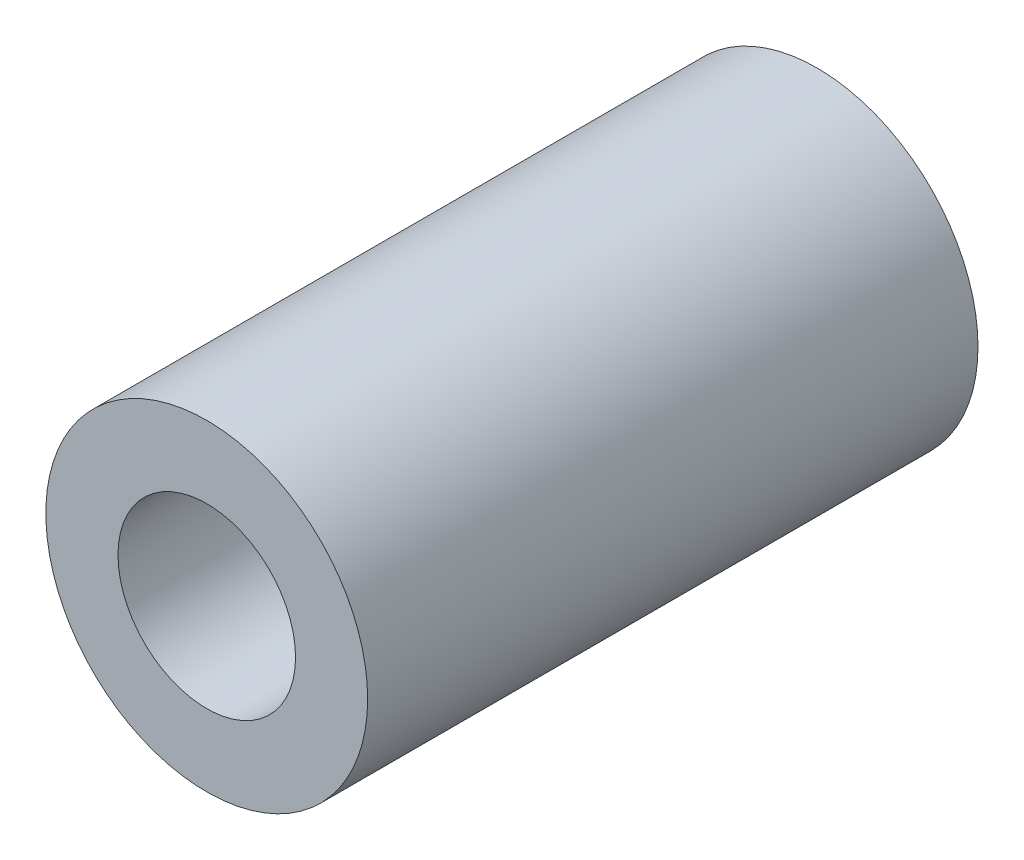
ISO-10303-21;
HEADER;
FILE_DESCRIPTION(('STEP AP214'),'2;1');
FILE_NAME('part.step','',(''),(''),'','','');
FILE_SCHEMA(('AUTOMOTIVE_DESIGN { 1 0 10303 214 1 1 1 1 }'));
ENDSEC;
DATA;
#1=APPLICATION_CONTEXT('core data for automotive mechanical design processes');
#2=APPLICATION_PROTOCOL_DEFINITION('international standard','automotive_design',2000,#1);
#3=PRODUCT_CONTEXT('',#1,'mechanical');
#4=PRODUCT('Part','Part','',(#3));
#5=PRODUCT_RELATED_PRODUCT_CATEGORY('part','',(#4));
#6=PRODUCT_DEFINITION_FORMATION('','',#4);
#7=PRODUCT_DEFINITION_CONTEXT('part definition',#1,'design');
#8=PRODUCT_DEFINITION('design','',#6,#7);
#9=PRODUCT_DEFINITION_SHAPE('','',#8);
#10=(LENGTH_UNIT() NAMED_UNIT(*) SI_UNIT(.MILLI.,.METRE.));
#11=(NAMED_UNIT(*) PLANE_ANGLE_UNIT() SI_UNIT($,.RADIAN.));
#12=(NAMED_UNIT(*) SI_UNIT($,.STERADIAN.) SOLID_ANGLE_UNIT());
#13=UNCERTAINTY_MEASURE_WITH_UNIT(LENGTH_MEASURE(1.E-05),#10,'distance_accuracy_value','');
#14=(GEOMETRIC_REPRESENTATION_CONTEXT(3) GLOBAL_UNCERTAINTY_ASSIGNED_CONTEXT((#13)) GLOBAL_UNIT_ASSIGNED_CONTEXT((#10,
#11,#12)) REPRESENTATION_CONTEXT('',''));
#15=CARTESIAN_POINT('',(0.,0.,0.));
#16=DIRECTION('',(0.,0.,1.));
#17=DIRECTION('',(1.,0.,0.));
#18=AXIS2_PLACEMENT_3D('',#15,#16,#17);
#19=CARTESIAN_POINT('',(0.,0.,11.));
#20=DIRECTION('',(0.,0.,-1.));
#21=DIRECTION('',(-1.,0.,0.));
#22=AXIS2_PLACEMENT_3D('',#19,#20,#21);
#23=CYLINDRICAL_SURFACE('',#22,2.9);
#24=CARTESIAN_POINT('',(0.,0.,11.));
#25=DIRECTION('',(0.,0.,1.));
#26=DIRECTION('',(1.,0.,0.));
#27=AXIS2_PLACEMENT_3D('',#24,#25,#26);
#28=CIRCLE('',#27,2.9);
#29=CARTESIAN_POINT('',(2.9,0.,11.));
#30=VERTEX_POINT('',#29);
#31=EDGE_CURVE('E10',#30,#30,#28,.T.);
#32=ORIENTED_EDGE('',*,*,#31,.F.);
#33=EDGE_LOOP('',(#32));
#34=FACE_BOUND('',#33,.T.);
#35=CARTESIAN_POINT('',(0.,0.,0.));
#36=DIRECTION('',(0.,0.,1.));
#37=DIRECTION('',(1.,0.,0.));
#38=AXIS2_PLACEMENT_3D('',#35,#36,#37);
#39=CIRCLE('',#38,2.9);
#40=CARTESIAN_POINT('',(2.9,0.,0.));
#41=VERTEX_POINT('',#40);
#42=EDGE_CURVE('E44',#41,#41,#39,.T.);
#43=ORIENTED_EDGE('',*,*,#42,.T.);
#44=EDGE_LOOP('',(#43));
#45=FACE_BOUND('',#44,.T.);
#46=ADVANCED_FACE('F41',(#34,#45),#23,.T.);
#47=CARTESIAN_POINT('',(0.,0.,11.));
#48=DIRECTION('',(0.,0.,1.));
#49=DIRECTION('',(1.,0.,0.));
#50=AXIS2_PLACEMENT_3D('',#47,#48,#49);
#51=PLANE('',#50);
#52=CARTESIAN_POINT('',(0.,0.,11.));
#53=DIRECTION('',(0.,0.,1.));
#54=DIRECTION('',(1.,0.,0.));
#55=AXIS2_PLACEMENT_3D('',#52,#53,#54);
#56=CIRCLE('',#55,1.6);
#57=CARTESIAN_POINT('',(1.6,0.,11.));
#58=VERTEX_POINT('',#57);
#59=EDGE_CURVE('E53',#58,#58,#56,.T.);
#60=ORIENTED_EDGE('',*,*,#59,.F.);
#61=EDGE_LOOP('',(#60));
#62=FACE_BOUND('',#61,.T.);
#63=ORIENTED_EDGE('',*,*,#31,.T.);
#64=EDGE_LOOP('',(#63));
#65=FACE_BOUND('',#64,.T.);
#66=ADVANCED_FACE('F68',(#62,#65),#51,.T.);
#67=CARTESIAN_POINT('',(0.,0.,0.));
#68=DIRECTION('',(0.,0.,1.));
#69=DIRECTION('',(1.,0.,0.));
#70=AXIS2_PLACEMENT_3D('',#67,#68,#69);
#71=PLANE('',#70);
#72=CARTESIAN_POINT('',(0.,0.,0.));
#73=DIRECTION('',(0.,0.,1.));
#74=DIRECTION('',(1.,0.,0.));
#75=AXIS2_PLACEMENT_3D('',#72,#73,#74);
#76=CIRCLE('',#75,1.6);
#77=CARTESIAN_POINT('',(1.6,0.,0.));
#78=VERTEX_POINT('',#77);
#79=EDGE_CURVE('E51',#78,#78,#76,.T.);
#80=ORIENTED_EDGE('',*,*,#79,.T.);
#81=EDGE_LOOP('',(#80));
#82=FACE_BOUND('',#81,.T.);
#83=ORIENTED_EDGE('',*,*,#42,.F.);
#84=EDGE_LOOP('',(#83));
#85=FACE_BOUND('',#84,.T.);
#86=ADVANCED_FACE('F59',(#82,#85),#71,.F.);
#87=CARTESIAN_POINT('',(0.,0.,0.));
#88=DIRECTION('',(0.,0.,1.));
#89=DIRECTION('',(1.,0.,0.));
#90=AXIS2_PLACEMENT_3D('',#87,#88,#89);
#91=CYLINDRICAL_SURFACE('',#90,1.6);
#92=ORIENTED_EDGE('',*,*,#79,.F.);
#93=EDGE_LOOP('',(#92));
#94=FACE_BOUND('',#93,.T.);
#95=ORIENTED_EDGE('',*,*,#59,.T.);
#96=EDGE_LOOP('',(#95));
#97=FACE_BOUND('',#96,.T.);
#98=ADVANCED_FACE('F62',(#94,#97),#91,.F.);
#99=CLOSED_SHELL('',(#46,#66,#86,#98));
#100=MANIFOLD_SOLID_BREP('B2',#99);
#101=ADVANCED_BREP_SHAPE_REPRESENTATION('',(#18,#100),#14);
#102=SHAPE_DEFINITION_REPRESENTATION(#9,#101);
ENDSEC;
END-ISO-10303-21;
